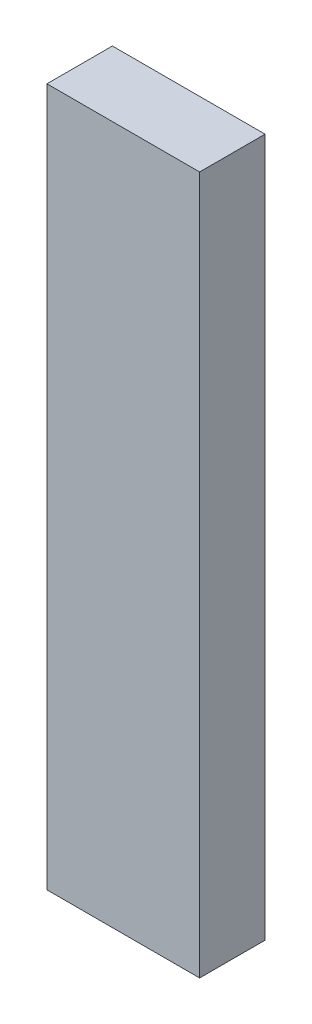
ISO-10303-21;
HEADER;
FILE_DESCRIPTION(('STEP AP214'),'2;1');
FILE_NAME('part.step','',(''),(''),'','','');
FILE_SCHEMA(('AUTOMOTIVE_DESIGN { 1 0 10303 214 1 1 1 1 }'));
ENDSEC;
DATA;
#1=APPLICATION_CONTEXT('core data for automotive mechanical design processes');
#2=APPLICATION_PROTOCOL_DEFINITION('international standard','automotive_design',2000,#1);
#3=PRODUCT_CONTEXT('',#1,'mechanical');
#4=PRODUCT('Part','Part','',(#3));
#5=PRODUCT_RELATED_PRODUCT_CATEGORY('part','',(#4));
#6=PRODUCT_DEFINITION_FORMATION('','',#4);
#7=PRODUCT_DEFINITION_CONTEXT('part definition',#1,'design');
#8=PRODUCT_DEFINITION('design','',#6,#7);
#9=PRODUCT_DEFINITION_SHAPE('','',#8);
#10=(LENGTH_UNIT() NAMED_UNIT(*) SI_UNIT(.MILLI.,.METRE.));
#11=(NAMED_UNIT(*) PLANE_ANGLE_UNIT() SI_UNIT($,.RADIAN.));
#12=(NAMED_UNIT(*) SI_UNIT($,.STERADIAN.) SOLID_ANGLE_UNIT());
#13=UNCERTAINTY_MEASURE_WITH_UNIT(LENGTH_MEASURE(1.E-05),#10,'distance_accuracy_value','');
#14=(GEOMETRIC_REPRESENTATION_CONTEXT(3) GLOBAL_UNCERTAINTY_ASSIGNED_CONTEXT((#13)) GLOBAL_UNIT_ASSIGNED_CONTEXT((#10,
#11,#12)) REPRESENTATION_CONTEXT('',''));
#15=CARTESIAN_POINT('',(0.,0.,0.));
#16=DIRECTION('',(0.,0.,1.));
#17=DIRECTION('',(1.,0.,0.));
#18=AXIS2_PLACEMENT_3D('',#15,#16,#17);
#19=CARTESIAN_POINT('',(0.,406.4,-38.1));
#20=DIRECTION('',(0.,0.,-1.));
#21=DIRECTION('',(-1.,0.,0.));
#22=AXIS2_PLACEMENT_3D('',#19,#20,#21);
#23=PLANE('',#22);
#24=DIRECTION('',(1.,0.,0.));
#25=VECTOR('',#24,1.);
#26=CARTESIAN_POINT('',(0.,0.,-38.1));
#27=LINE('',#26,#25);
#28=CARTESIAN_POINT('',(0.,0.,-38.1));
#29=VERTEX_POINT('',#28);
#30=CARTESIAN_POINT('',(88.9,0.,-38.1));
#31=VERTEX_POINT('',#30);
#32=EDGE_CURVE('E99',#29,#31,#27,.T.);
#33=ORIENTED_EDGE('',*,*,#32,.F.);
#34=DIRECTION('',(0.,-1.,0.));
#35=VECTOR('',#34,1.);
#36=CARTESIAN_POINT('',(0.,406.4,-38.1));
#37=LINE('',#36,#35);
#38=CARTESIAN_POINT('',(0.,406.4,-38.1));
#39=VERTEX_POINT('',#38);
#40=EDGE_CURVE('E11',#39,#29,#37,.T.);
#41=ORIENTED_EDGE('',*,*,#40,.F.);
#42=DIRECTION('',(1.,0.,0.));
#43=VECTOR('',#42,1.);
#44=CARTESIAN_POINT('',(0.,406.4,-38.1));
#45=LINE('',#44,#43);
#46=CARTESIAN_POINT('',(88.9,406.4,-38.1));
#47=VERTEX_POINT('',#46);
#48=EDGE_CURVE('E93',#39,#47,#45,.T.);
#49=ORIENTED_EDGE('',*,*,#48,.T.);
#50=DIRECTION('',(0.,-1.,0.));
#51=VECTOR('',#50,1.);
#52=CARTESIAN_POINT('',(88.9,406.4,-38.1));
#53=LINE('',#52,#51);
#54=EDGE_CURVE('E38',#47,#31,#53,.T.);
#55=ORIENTED_EDGE('',*,*,#54,.T.);
#56=EDGE_LOOP('',(#33,#41,#49,#55));
#57=FACE_BOUND('',#56,.T.);
#58=ADVANCED_FACE('F35',(#57),#23,.T.);
#59=CARTESIAN_POINT('',(0.,406.4,0.));
#60=DIRECTION('',(-1.,0.,0.));
#61=DIRECTION('',(0.,0.,1.));
#62=AXIS2_PLACEMENT_3D('',#59,#60,#61);
#63=PLANE('',#62);
#64=DIRECTION('',(0.,0.,-1.));
#65=VECTOR('',#64,1.);
#66=CARTESIAN_POINT('',(0.,0.,0.));
#67=LINE('',#66,#65);
#68=CARTESIAN_POINT('',(0.,0.,0.));
#69=VERTEX_POINT('',#68);
#70=EDGE_CURVE('E95',#69,#29,#67,.T.);
#71=ORIENTED_EDGE('',*,*,#70,.F.);
#72=DIRECTION('',(0.,-1.,0.));
#73=VECTOR('',#72,1.);
#74=CARTESIAN_POINT('',(0.,406.4,0.));
#75=LINE('',#74,#73);
#76=CARTESIAN_POINT('',(0.,406.4,0.));
#77=VERTEX_POINT('',#76);
#78=EDGE_CURVE('E44',#77,#69,#75,.T.);
#79=ORIENTED_EDGE('',*,*,#78,.F.);
#80=DIRECTION('',(0.,0.,-1.));
#81=VECTOR('',#80,1.);
#82=CARTESIAN_POINT('',(0.,406.4,0.));
#83=LINE('',#82,#81);
#84=EDGE_CURVE('E83',#77,#39,#83,.T.);
#85=ORIENTED_EDGE('',*,*,#84,.T.);
#86=ORIENTED_EDGE('',*,*,#40,.T.);
#87=EDGE_LOOP('',(#71,#79,#85,#86));
#88=FACE_BOUND('',#87,.T.);
#89=ADVANCED_FACE('F109',(#88),#63,.T.);
#90=CARTESIAN_POINT('',(0.,406.4,0.));
#91=DIRECTION('',(0.,0.,-1.));
#92=DIRECTION('',(-1.,0.,0.));
#93=AXIS2_PLACEMENT_3D('',#90,#91,#92);
#94=PLANE('',#93);
#95=DIRECTION('',(1.,0.,0.));
#96=VECTOR('',#95,1.);
#97=CARTESIAN_POINT('',(0.,0.,0.));
#98=LINE('',#97,#96);
#99=CARTESIAN_POINT('',(88.9,0.,0.));
#100=VERTEX_POINT('',#99);
#101=EDGE_CURVE('E88',#69,#100,#98,.T.);
#102=ORIENTED_EDGE('',*,*,#101,.T.);
#103=DIRECTION('',(0.,-1.,0.));
#104=VECTOR('',#103,1.);
#105=CARTESIAN_POINT('',(88.9,406.4,0.));
#106=LINE('',#105,#104);
#107=CARTESIAN_POINT('',(88.9,406.4,0.));
#108=VERTEX_POINT('',#107);
#109=EDGE_CURVE('E86',#108,#100,#106,.T.);
#110=ORIENTED_EDGE('',*,*,#109,.F.);
#111=DIRECTION('',(1.,0.,0.));
#112=VECTOR('',#111,1.);
#113=CARTESIAN_POINT('',(0.,406.4,0.));
#114=LINE('',#113,#112);
#115=EDGE_CURVE('E80',#77,#108,#114,.T.);
#116=ORIENTED_EDGE('',*,*,#115,.F.);
#117=ORIENTED_EDGE('',*,*,#78,.T.);
#118=EDGE_LOOP('',(#102,#110,#116,#117));
#119=FACE_BOUND('',#118,.T.);
#120=ADVANCED_FACE('F87',(#119),#94,.F.);
#121=CARTESIAN_POINT('',(88.9,406.4,0.));
#122=DIRECTION('',(-1.,0.,0.));
#123=DIRECTION('',(0.,0.,1.));
#124=AXIS2_PLACEMENT_3D('',#121,#122,#123);
#125=PLANE('',#124);
#126=DIRECTION('',(0.,0.,-1.));
#127=VECTOR('',#126,1.);
#128=CARTESIAN_POINT('',(88.9,0.,0.));
#129=LINE('',#128,#127);
#130=EDGE_CURVE('E102',#100,#31,#129,.T.);
#131=ORIENTED_EDGE('',*,*,#130,.T.);
#132=ORIENTED_EDGE('',*,*,#54,.F.);
#133=DIRECTION('',(0.,0.,-1.));
#134=VECTOR('',#133,1.);
#135=CARTESIAN_POINT('',(88.9,406.4,0.));
#136=LINE('',#135,#134);
#137=EDGE_CURVE('E77',#108,#47,#136,.T.);
#138=ORIENTED_EDGE('',*,*,#137,.F.);
#139=ORIENTED_EDGE('',*,*,#109,.T.);
#140=EDGE_LOOP('',(#131,#132,#138,#139));
#141=FACE_BOUND('',#140,.T.);
#142=ADVANCED_FACE('F92',(#141),#125,.F.);
#143=CARTESIAN_POINT('',(0.,406.4,0.));
#144=DIRECTION('',(0.,1.,0.));
#145=DIRECTION('',(0.,0.,1.));
#146=AXIS2_PLACEMENT_3D('',#143,#144,#145);
#147=PLANE('',#146);
#148=ORIENTED_EDGE('',*,*,#48,.F.);
#149=ORIENTED_EDGE('',*,*,#84,.F.);
#150=ORIENTED_EDGE('',*,*,#115,.T.);
#151=ORIENTED_EDGE('',*,*,#137,.T.);
#152=EDGE_LOOP('',(#148,#149,#150,#151));
#153=FACE_BOUND('',#152,.T.);
#154=ADVANCED_FACE('F82',(#153),#147,.T.);
#155=CARTESIAN_POINT('',(0.,0.,0.));
#156=DIRECTION('',(0.,1.,0.));
#157=DIRECTION('',(0.,0.,1.));
#158=AXIS2_PLACEMENT_3D('',#155,#156,#157);
#159=PLANE('',#158);
#160=ORIENTED_EDGE('',*,*,#32,.T.);
#161=ORIENTED_EDGE('',*,*,#130,.F.);
#162=ORIENTED_EDGE('',*,*,#101,.F.);
#163=ORIENTED_EDGE('',*,*,#70,.T.);
#164=EDGE_LOOP('',(#160,#161,#162,#163));
#165=FACE_BOUND('',#164,.T.);
#166=ADVANCED_FACE('F108',(#165),#159,.F.);
#167=CLOSED_SHELL('',(#58,#89,#120,#142,#154,#166));
#168=MANIFOLD_SOLID_BREP('B2',#167);
#169=ADVANCED_BREP_SHAPE_REPRESENTATION('',(#18,#168),#14);
#170=SHAPE_DEFINITION_REPRESENTATION(#9,#169);
ENDSEC;
END-ISO-10303-21;
